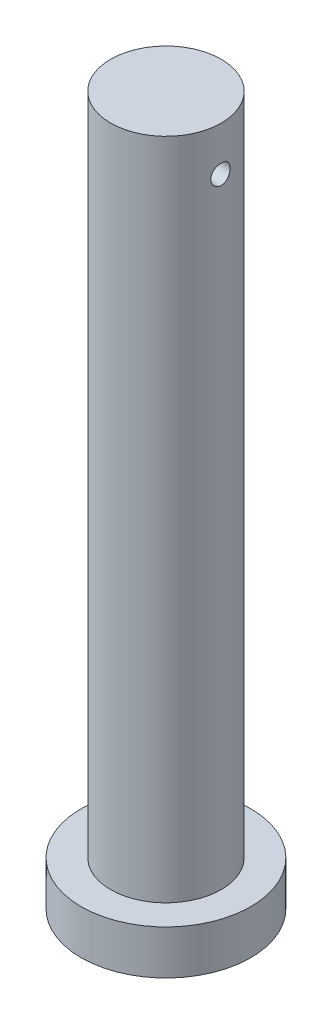
ISO-10303-21;
HEADER;
FILE_DESCRIPTION(('STEP AP214'),'2;1');
FILE_NAME('part.step','',(''),(''),'','','');
FILE_SCHEMA(('AUTOMOTIVE_DESIGN { 1 0 10303 214 1 1 1 1 }'));
ENDSEC;
DATA;
#1=APPLICATION_CONTEXT('core data for automotive mechanical design processes');
#2=APPLICATION_PROTOCOL_DEFINITION('international standard','automotive_design',2000,#1);
#3=PRODUCT_CONTEXT('',#1,'mechanical');
#4=PRODUCT('Part','Part','',(#3));
#5=PRODUCT_RELATED_PRODUCT_CATEGORY('part','',(#4));
#6=PRODUCT_DEFINITION_FORMATION('','',#4);
#7=PRODUCT_DEFINITION_CONTEXT('part definition',#1,'design');
#8=PRODUCT_DEFINITION('design','',#6,#7);
#9=PRODUCT_DEFINITION_SHAPE('','',#8);
#10=(LENGTH_UNIT() NAMED_UNIT(*) SI_UNIT(.MILLI.,.METRE.));
#11=(NAMED_UNIT(*) PLANE_ANGLE_UNIT() SI_UNIT($,.RADIAN.));
#12=(NAMED_UNIT(*) SI_UNIT($,.STERADIAN.) SOLID_ANGLE_UNIT());
#13=UNCERTAINTY_MEASURE_WITH_UNIT(LENGTH_MEASURE(1.E-05),#10,'distance_accuracy_value','');
#14=(GEOMETRIC_REPRESENTATION_CONTEXT(3) GLOBAL_UNCERTAINTY_ASSIGNED_CONTEXT((#13)) GLOBAL_UNIT_ASSIGNED_CONTEXT((#10,
#11,#12)) REPRESENTATION_CONTEXT('',''));
#15=CARTESIAN_POINT('',(0.,0.,0.));
#16=DIRECTION('',(0.,0.,1.));
#17=DIRECTION('',(1.,0.,0.));
#18=AXIS2_PLACEMENT_3D('',#15,#16,#17);
#19=CARTESIAN_POINT('',(0.00144443242377544,63.2889157351468,-3.00224429916459E-06));
#20=DIRECTION('',(0.,-1.,0.));
#21=DIRECTION('',(0.,0.,-1.));
#22=AXIS2_PLACEMENT_3D('',#19,#20,#21);
#23=CYLINDRICAL_SURFACE('',#22,7.59);
#24=CARTESIAN_POINT('',(0.00144443242377544,63.2889157351468,-3.00224429916459E-06));
#25=DIRECTION('',(0.,1.,0.));
#26=DIRECTION('',(0.,0.,1.));
#27=AXIS2_PLACEMENT_3D('',#24,#25,#26);
#28=CIRCLE('',#27,7.59);
#29=CARTESIAN_POINT('',(0.00144443242377544,63.2889157351468,7.5899969977557));
#30=VERTEX_POINT('',#29);
#31=EDGE_CURVE('E49',#30,#30,#28,.T.);
#32=ORIENTED_EDGE('',*,*,#31,.F.);
#33=EDGE_LOOP('',(#32));
#34=FACE_BOUND('',#33,.T.);
#35=CARTESIAN_POINT('',(0.00144443242377544,59.3289157351468,-3.00224429916459E-06));
#36=DIRECTION('',(0.,1.,0.));
#37=DIRECTION('',(0.,0.,1.));
#38=AXIS2_PLACEMENT_3D('',#35,#36,#37);
#39=CIRCLE('',#38,7.59);
#40=CARTESIAN_POINT('',(0.00144443242377544,59.3289157351468,7.5899969977557));
#41=VERTEX_POINT('',#40);
#42=EDGE_CURVE('E55',#41,#41,#39,.T.);
#43=ORIENTED_EDGE('',*,*,#42,.T.);
#44=EDGE_LOOP('',(#43));
#45=FACE_BOUND('',#44,.T.);
#46=ADVANCED_FACE('F36',(#34,#45),#23,.T.);
#47=CARTESIAN_POINT('',(0.00144443242377544,63.2889157351468,-3.00224429916459E-06));
#48=DIRECTION('',(0.,1.,0.));
#49=DIRECTION('',(0.,0.,1.));
#50=AXIS2_PLACEMENT_3D('',#47,#48,#49);
#51=PLANE('',#50);
#52=CARTESIAN_POINT('',(0.00144443242377544,63.2889157351468,-3.00224429916459E-06));
#53=DIRECTION('',(0.,1.,0.));
#54=DIRECTION('',(0.,0.,1.));
#55=AXIS2_PLACEMENT_3D('',#52,#53,#54);
#56=CIRCLE('',#55,4.95);
#57=CARTESIAN_POINT('',(0.00144443242377544,63.2889157351468,4.9499969977557));
#58=VERTEX_POINT('',#57);
#59=EDGE_CURVE('E10',#58,#58,#56,.T.);
#60=ORIENTED_EDGE('',*,*,#59,.F.);
#61=EDGE_LOOP('',(#60));
#62=FACE_BOUND('',#61,.T.);
#63=ORIENTED_EDGE('',*,*,#31,.T.);
#64=EDGE_LOOP('',(#63));
#65=FACE_BOUND('',#64,.T.);
#66=ADVANCED_FACE('F87',(#62,#65),#51,.T.);
#67=CARTESIAN_POINT('',(0.00144443242377544,59.3289157351468,-3.00224429916459E-06));
#68=DIRECTION('',(0.,1.,0.));
#69=DIRECTION('',(0.,0.,1.));
#70=AXIS2_PLACEMENT_3D('',#67,#68,#69);
#71=PLANE('',#70);
#72=ORIENTED_EDGE('',*,*,#42,.F.);
#73=EDGE_LOOP('',(#72));
#74=FACE_BOUND('',#73,.T.);
#75=ADVANCED_FACE('F83',(#74),#71,.F.);
#76=CARTESIAN_POINT('',(0.00144443242377544,122.688915735147,-3.00224429916459E-06));
#77=DIRECTION('',(0.,-1.,0.));
#78=DIRECTION('',(0.,0.,-1.));
#79=AXIS2_PLACEMENT_3D('',#76,#77,#78);
#80=CYLINDRICAL_SURFACE('',#79,4.95);
#81=CARTESIAN_POINT('',(-4.90007908052978,118.079459855754,-0.691065410398251));
#82=CARTESIAN_POINT('',(-4.89495599735033,118.118189925098,-0.727402755261876));
#83=CARTESIAN_POINT('',(-4.88987683232503,118.15999961325,-0.760501352822298));
#84=CARTESIAN_POINT('',(-4.88037601773705,118.248644342118,-0.819283445436213));
#85=CARTESIAN_POINT('',(-4.87595487823281,118.295483233234,-0.844961202707104));
#86=CARTESIAN_POINT('',(-4.86827746003247,118.392903744451,-0.888142679396293));
#87=CARTESIAN_POINT('',(-4.86502155809035,118.443486568702,-0.905643755622012));
#88=CARTESIAN_POINT('',(-4.86005982647335,118.546933908938,-0.931913562041067));
#89=CARTESIAN_POINT('',(-4.85835359246656,118.599797825979,-0.940684570099145));
#90=CARTESIAN_POINT('',(-4.85670336698135,118.705644231934,-0.949170357653602));
#91=CARTESIAN_POINT('',(-4.85673876697739,118.758617919909,-0.948991044748464));
#92=CARTESIAN_POINT('',(-4.85851632414475,118.863771407542,-0.939844772321565));
#93=CARTESIAN_POINT('',(-4.8602584844299,118.915951205751,-0.93087779676749));
#94=CARTESIAN_POINT('',(-4.86523119994961,119.01772690359,-0.904516677443337));
#95=CARTESIAN_POINT('',(-4.86845288906014,119.067336263067,-0.887172701536471));
#96=CARTESIAN_POINT('',(-4.87601727258415,119.162951410758,-0.844593104697442));
#97=CARTESIAN_POINT('',(-4.88036006031427,119.208956898582,-0.819356826798418));
#98=CARTESIAN_POINT('',(-4.88975026287195,119.296731677797,-0.761309466104932));
#99=CARTESIAN_POINT('',(-4.89480636362383,119.338435722807,-0.728401134229309));
#100=CARTESIAN_POINT('',(-4.90501701660969,119.415774373245,-0.656102122251911));
#101=CARTESIAN_POINT('',(-4.9101715766152,119.451408497347,-0.616710928564912));
#102=CARTESIAN_POINT('',(-4.92006965370436,119.51600552008,-0.532012923633531));
#103=CARTESIAN_POINT('',(-4.92480775845951,119.544886935462,-0.486643257803999));
#104=CARTESIAN_POINT('',(-4.93327168219786,119.594600831314,-0.39160193906133));
#105=CARTESIAN_POINT('',(-4.93699756380745,119.615433809777,-0.341930552547197));
#106=CARTESIAN_POINT('',(-4.94298749501117,119.648266326851,-0.240143524309112));
#107=CARTESIAN_POINT('',(-4.94526401832521,119.660341368709,-0.188052996782051));
#108=CARTESIAN_POINT('',(-4.9481485738841,119.67556672757,-0.0825402793940582));
#109=CARTESIAN_POINT('',(-4.94875678818397,119.678718018383,-0.0291182354775605));
#110=CARTESIAN_POINT('',(-4.9482402977819,119.676017378221,0.0766394281794855));
#111=CARTESIAN_POINT('',(-4.94714285842488,119.670307104005,0.12897886410566));
#112=CARTESIAN_POINT('',(-4.94338704993004,119.650326863459,0.231937530612856));
#113=CARTESIAN_POINT('',(-4.94072867173778,119.636056847476,0.282556751213748));
#114=CARTESIAN_POINT('',(-4.93413877047588,119.599377639861,0.380709694990385));
#115=CARTESIAN_POINT('',(-4.93020619821138,119.576961738902,0.428240836530293));
#116=CARTESIAN_POINT('',(-4.92149335727174,119.524640757121,0.518899962336921));
#117=CARTESIAN_POINT('',(-4.91671300191952,119.494734910399,0.56202749566894));
#118=CARTESIAN_POINT('',(-4.90673640667597,119.427712936716,0.643402792437063));
#119=CARTESIAN_POINT('',(-4.90153468163292,119.390487794818,0.681560127991395));
#120=CARTESIAN_POINT('',(-4.89136054695369,119.310161916337,0.751128530174347));
#121=CARTESIAN_POINT('',(-4.88638815044729,119.267060843896,0.782539210911107));
#122=CARTESIAN_POINT('',(-4.87719560863249,119.175794618887,0.837952418006076));
#123=CARTESIAN_POINT('',(-4.87298156661453,119.127592942686,0.861895885534244));
#124=CARTESIAN_POINT('',(-4.86584551099054,119.027756811035,0.90132540699342));
#125=CARTESIAN_POINT('',(-4.86292337435158,118.97612268301,0.916812266311424));
#126=CARTESIAN_POINT('',(-4.85874563059813,118.871562921165,0.938707051751908));
#127=CARTESIAN_POINT('',(-4.85746994586393,118.818661018978,0.945224422453119));
#128=CARTESIAN_POINT('',(-4.85667032727327,118.712501078637,0.949326180959766));
#129=CARTESIAN_POINT('',(-4.85714625090618,118.659243069808,0.946911295492366));
#130=CARTESIAN_POINT('',(-4.85977596134865,118.5545847389,0.933314779375771));
#131=CARTESIAN_POINT('',(-4.86190865363964,118.503169502747,0.922243355188658));
#132=CARTESIAN_POINT('',(-4.86758104226575,118.402937744208,0.891808951012929));
#133=CARTESIAN_POINT('',(-4.87112080929965,118.354121352543,0.872445554388615));
#134=CARTESIAN_POINT('',(-4.87923975000432,118.260062531262,0.825819815553157));
#135=CARTESIAN_POINT('',(-4.88382642012646,118.214849216405,0.798500091665455));
#136=CARTESIAN_POINT('',(-4.89351433303298,118.129604111476,0.736781700959269));
#137=CARTESIAN_POINT('',(-4.8986156291348,118.08957285927,0.702382300271248));
#138=CARTESIAN_POINT('',(-4.9088547342977,118.015180447045,0.626841569008801));
#139=CARTESIAN_POINT('',(-4.91399187940999,117.980917035736,0.585603802047339));
#140=CARTESIAN_POINT('',(-4.92364811071522,117.919790847489,0.497899240611265));
#141=CARTESIAN_POINT('',(-4.92816719898131,117.892928045726,0.451432463677349));
#142=CARTESIAN_POINT('',(-4.9360766682561,117.847412450377,0.354596056063887));
#143=CARTESIAN_POINT('',(-4.9394680630858,117.828752277561,0.304229981442878));
#144=CARTESIAN_POINT('',(-4.94474259401369,117.80019012017,0.200999646654863));
#145=CARTESIAN_POINT('',(-4.94662594275939,117.790286900767,0.148135739817424));
#146=CARTESIAN_POINT('',(-4.94865260491737,117.779644565855,0.0423382561333979));
#147=CARTESIAN_POINT('',(-4.94882393347962,117.778757901005,-0.0105799758400142));
#148=CARTESIAN_POINT('',(-4.94748042335546,117.785794092874,-0.115812577800432));
#149=CARTESIAN_POINT('',(-4.94596539593655,117.793717935642,-0.16812687953505));
#150=CARTESIAN_POINT('',(-4.94143343569516,117.818039361666,-0.270296006640914));
#151=CARTESIAN_POINT('',(-4.93842672868346,117.834379279497,-0.320165071689242));
#152=CARTESIAN_POINT('',(-4.93124400187464,117.875003888718,-0.416432432742597));
#153=CARTESIAN_POINT('',(-4.9270687789397,117.899283167804,-0.462833066794751));
#154=CARTESIAN_POINT('',(-4.91905933883654,117.948556841167,-0.54065095794003));
#155=CARTESIAN_POINT('',(-4.91537289192937,117.972062349154,-0.573037994175894));
#156=CARTESIAN_POINT('',(-4.90780904893326,118.022951259387,-0.634582403290295));
#157=CARTESIAN_POINT('',(-4.90393164673624,118.050334785733,-0.663739672761222));
#158=CARTESIAN_POINT('',(-4.90007908052978,118.079459855754,-0.691065410398251));
#159=B_SPLINE_CURVE_WITH_KNOTS('',3,(#81,#82,#83,#84,#85,#86,#87,#88,#89,#90,#91,#92,#93,#94,
#95,#96,#97,#98,#99,#100,#101,#102,#103,#104,#105,#106,#107,#108,#109,#110,#111,#112,#113,#114,
#115,#116,#117,#118,#119,#120,#121,#122,#123,#124,#125,#126,#127,#128,#129,#130,#131,#132,#133,
#134,#135,#136,#137,#138,#139,#140,#141,#142,#143,#144,#145,#146,#147,#148,#149,#150,#151,#152,
#153,#154,#155,#156,#157,#158),.UNSPECIFIED.,.T.,.F.,(4,2,2,2,2,2,2,2,2,2,2,2,2,2,2,2,2,2,2,2,2,
2,2,2,2,2,2,2,2,2,2,2,2,2,2,2,2,2,4),(0.,0.159919810378797,0.31996294170883,0.480057772820829,
0.640110820748888,0.798270442792579,0.956430353385052,1.1136546103276,1.27089195833433,
1.43024262698426,1.58960592579369,1.75080299909523,1.91199009683643,2.07177050588673,
2.23153347812964,2.38876874045826,2.54600491485907,2.70337089085917,2.86075296519478,
3.02068606367833,3.18062830750236,3.34180522139413,3.50296678250641,3.66214389393297,
3.82130805501596,3.97847824967643,4.13565634238519,4.2939973427624,4.45235476482382,
4.61317233441302,4.7739893645563,4.93466142330099,5.09531082190851,5.25332699511903,
5.41136085485845,5.56832602191853,5.72518440729349,5.84544049453635,5.9657004309124),.UNSPECIFIED.);
#160=CARTESIAN_POINT('',(-4.90007908052978,118.079459855754,-0.691065410398251));
#161=VERTEX_POINT('',#160);
#162=EDGE_CURVE('E39',#161,#161,#159,.T.);
#163=ORIENTED_EDGE('',*,*,#162,.T.);
#164=EDGE_LOOP('',(#163));
#165=FACE_BOUND('',#164,.T.);
#166=CARTESIAN_POINT('',(4.91067083887217,118.138168956503,-0.63403461835647));
#167=CARTESIAN_POINT('',(4.91495710541087,118.102601342336,-0.600844052219494));
#168=CARTESIAN_POINT('',(4.91929003064715,118.069818375723,-0.56463744786279));
#169=CARTESIAN_POINT('',(4.92756540903833,118.010750460956,-0.487187018259596));
#170=CARTESIAN_POINT('',(4.93150751368769,117.984471281718,-0.445938769125461));
#171=CARTESIAN_POINT('',(4.93855916059895,117.939182236374,-0.359549746870321));
#172=CARTESIAN_POINT('',(4.94166861169937,117.920173166126,-0.314408548251949));
#173=CARTESIAN_POINT('',(4.94670376652469,117.890005512968,-0.22152255179351));
#174=CARTESIAN_POINT('',(4.94862978096096,117.878844869341,-0.173778440935357));
#175=CARTESIAN_POINT('',(4.95106985256949,117.864777825604,-0.0774979613639254));
#176=CARTESIAN_POINT('',(4.95159659906627,117.861797236051,-0.0289727558949961));
#177=CARTESIAN_POINT('',(4.95121575203002,117.863970871397,0.0678893210379334));
#178=CARTESIAN_POINT('',(4.95030817653731,117.869124993981,0.116226194863029));
#179=CARTESIAN_POINT('',(4.94717253532651,117.887336365243,0.210956261598021));
#180=CARTESIAN_POINT('',(4.94495459824257,117.900333010274,0.257361471183867));
#181=CARTESIAN_POINT('',(4.93944937110962,117.933789500525,0.347330167766493));
#182=CARTESIAN_POINT('',(4.93616202564737,117.954249732489,0.390893507366385));
#183=CARTESIAN_POINT('',(4.92884323940337,118.002252281893,0.474352052798321));
#184=CARTESIAN_POINT('',(4.92480572103606,118.029853223757,0.514212994257115));
#185=CARTESIAN_POINT('',(4.91644740073882,118.09128550072,0.58877182136046));
#186=CARTESIAN_POINT('',(4.91212657606183,118.1251173365,0.623469291689821));
#187=CARTESIAN_POINT('',(4.90362733365883,118.198521337878,0.687127544309741));
#188=CARTESIAN_POINT('',(4.89945113755306,118.23815529945,0.716017428026313));
#189=CARTESIAN_POINT('',(4.89176992574337,118.321773754699,0.766728325135616));
#190=CARTESIAN_POINT('',(4.88826489219767,118.365758132679,0.788549526448677));
#191=CARTESIAN_POINT('',(4.88234443491948,118.456667864534,0.824403538417949));
#192=CARTESIAN_POINT('',(4.87992483229983,118.503581133006,0.838466267976142));
#193=CARTESIAN_POINT('',(4.87644062486845,118.599152835874,0.858493952570328));
#194=CARTESIAN_POINT('',(4.87537587893801,118.647811087972,0.864459750968174));
#195=CARTESIAN_POINT('',(4.8747326663141,118.744741117052,0.868078185566242));
#196=CARTESIAN_POINT('',(4.87513301074659,118.793008364452,0.865849334720945));
#197=CARTESIAN_POINT('',(4.87732591183052,118.888469681685,0.853413021218388));
#198=CARTESIAN_POINT('',(4.87911844864047,118.935663766804,0.843205672270515));
#199=CARTESIAN_POINT('',(4.88388209186337,119.027515910211,0.815167077051827));
#200=CARTESIAN_POINT('',(4.88684983214725,119.072180798815,0.797357594274002));
#201=CARTESIAN_POINT('',(4.89363007048692,119.157906037091,0.75463946170205));
#202=CARTESIAN_POINT('',(4.89744263782594,119.198966090749,0.729730229618249));
#203=CARTESIAN_POINT('',(4.90554542483431,119.276895920403,0.673137881886917));
#204=CARTESIAN_POINT('',(4.90984123534723,119.313703926405,0.641370499509886));
#205=CARTESIAN_POINT('',(4.91839200437986,119.381505579333,0.572134071007319));
#206=CARTESIAN_POINT('',(4.92264696035603,119.412498866443,0.534664672299984));
#207=CARTESIAN_POINT('',(4.93068337070698,119.468071022649,0.454674058054703));
#208=CARTESIAN_POINT('',(4.93446014508153,119.492588716103,0.412109824929217));
#209=CARTESIAN_POINT('',(4.94106879361024,119.534117620665,0.323396218914026));
#210=CARTESIAN_POINT('',(4.94390072277201,119.551129268784,0.277247054927042));
#211=CARTESIAN_POINT('',(4.9482810397018,119.577025353334,0.1830578651317));
#212=CARTESIAN_POINT('',(4.94983944821479,119.585973297854,0.135035779042568));
#213=CARTESIAN_POINT('',(4.95153441764175,119.595692651382,0.0381479535342224));
#214=CARTESIAN_POINT('',(4.95167109045031,119.596464703857,-0.0107177191891438));
#215=CARTESIAN_POINT('',(4.95051441082428,119.58984889653,-0.107298464628172));
#216=CARTESIAN_POINT('',(4.94923777148371,119.582556404913,-0.155020310144521));
#217=CARTESIAN_POINT('',(4.94542223473708,119.560187578257,-0.248549427792865));
#218=CARTESIAN_POINT('',(4.94288331336217,119.545111095411,-0.294356663551363));
#219=CARTESIAN_POINT('',(4.93681211941417,119.507566439719,-0.38291741757463));
#220=CARTESIAN_POINT('',(4.93327700127948,119.485077060799,-0.425661741632605));
#221=CARTESIAN_POINT('',(4.92560152583394,119.43335682107,-0.506796823788057));
#222=CARTESIAN_POINT('',(4.92146111497168,119.404125363644,-0.545187196148833));
#223=CARTESIAN_POINT('',(4.91296937703276,119.339297092933,-0.617053515473072));
#224=CARTESIAN_POINT('',(4.90861600524159,119.303622332519,-0.65045894172955));
#225=CARTESIAN_POINT('',(4.90023650137563,119.227146743741,-0.710824792553616));
#226=CARTESIAN_POINT('',(4.8962103772644,119.186345790694,-0.737785060309052));
#227=CARTESIAN_POINT('',(4.88893280724195,119.100615761238,-0.784554824756106));
#228=CARTESIAN_POINT('',(4.88568356327082,119.05567543972,-0.804344076230442));
#229=CARTESIAN_POINT('',(4.88035437571958,118.963038335261,-0.836064367139764));
#230=CARTESIAN_POINT('',(4.87827428829097,118.915341892218,-0.847996373330872));
#231=CARTESIAN_POINT('',(4.87554841074343,118.819208076311,-0.863526312934187));
#232=CARTESIAN_POINT('',(4.87488433531464,118.770788383289,-0.867230520343747));
#233=CARTESIAN_POINT('',(4.87501404632702,118.674004949586,-0.866501380162994));
#234=CARTESIAN_POINT('',(4.87580799964586,118.625641215943,-0.862067101087897));
#235=CARTESIAN_POINT('',(4.87874715855729,118.530799242633,-0.845277339017472));
#236=CARTESIAN_POINT('',(4.880880384905,118.484308135667,-0.832992062691066));
#237=CARTESIAN_POINT('',(4.88624315610844,118.394078296929,-0.800942093774801));
#238=CARTESIAN_POINT('',(4.88947184261435,118.350337441904,-0.781183255720747));
#239=CARTESIAN_POINT('',(4.89571662639171,118.277760730172,-0.740878687494287));
#240=CARTESIAN_POINT('',(4.89856601344925,118.248026537423,-0.721901311573655));
#241=CARTESIAN_POINT('',(4.90449240022355,118.191098532351,-0.680487242690345));
#242=CARTESIAN_POINT('',(4.90756940522893,118.163904779088,-0.658050469336765));
#243=CARTESIAN_POINT('',(4.91067083887217,118.138168956503,-0.63403461835647));
#244=B_SPLINE_CURVE_WITH_KNOTS('',3,(#166,#167,#168,#169,#170,#171,#172,#173,#174,#175,#176,
#177,#178,#179,#180,#181,#182,#183,#184,#185,#186,#187,#188,#189,#190,#191,#192,#193,#194,#195,
#196,#197,#198,#199,#200,#201,#202,#203,#204,#205,#206,#207,#208,#209,#210,#211,#212,#213,#214,
#215,#216,#217,#218,#219,#220,#221,#222,#223,#224,#225,#226,#227,#228,#229,#230,#231,#232,#233,
#234,#235,#236,#237,#238,#239,#240,#241,#242,#243),.UNSPECIFIED.,.T.,.F.,(4,2,2,2,2,2,2,2,2,2,2,
2,2,2,2,2,2,2,2,2,2,2,2,2,2,2,2,2,2,2,2,2,2,2,2,2,2,2,4),(0.,0.146383987221714,
0.292897356643748,0.439426760246597,0.585917676088291,0.731075523886072,0.876231545960383,
1.0202799778165,1.16433587498146,1.30961421409349,1.45490423211797,1.60187259646175,
1.74883705334315,1.89523073932669,2.04160917603553,2.18587903531548,2.33014683850194,
2.47400437093919,2.6178737053243,2.76362311087214,2.90938153243836,3.05647132353867,
3.20355254977624,3.34946500564989,3.49536597771677,3.63955985648453,3.7837564733842,
3.92836922650252,4.07299478154111,4.21950402001368,4.36601682272617,4.51294009584595,
4.65984528813439,4.80484167301111,4.94985465438264,5.09358868113263,5.23721034391834,
5.34312761880362,5.44904735540918),.UNSPECIFIED.);
#245=CARTESIAN_POINT('',(4.91067083887217,118.138168956503,-0.63403461835647));
#246=VERTEX_POINT('',#245);
#247=EDGE_CURVE('E62',#246,#246,#244,.T.);
#248=ORIENTED_EDGE('',*,*,#247,.T.);
#249=EDGE_LOOP('',(#248));
#250=FACE_BOUND('',#249,.T.);
#251=CARTESIAN_POINT('',(0.00144443242377544,122.688915735147,-3.00224429916459E-06));
#252=DIRECTION('',(0.,1.,0.));
#253=DIRECTION('',(0.,0.,1.));
#254=AXIS2_PLACEMENT_3D('',#251,#252,#253);
#255=CIRCLE('',#254,4.95);
#256=CARTESIAN_POINT('',(0.00144443242377544,122.688915735147,4.9499969977557));
#257=VERTEX_POINT('',#256);
#258=EDGE_CURVE('E58',#257,#257,#255,.T.);
#259=ORIENTED_EDGE('',*,*,#258,.F.);
#260=EDGE_LOOP('',(#259));
#261=FACE_BOUND('',#260,.T.);
#262=ORIENTED_EDGE('',*,*,#59,.T.);
#263=EDGE_LOOP('',(#262));
#264=FACE_BOUND('',#263,.T.);
#265=ADVANCED_FACE('F68',(#165,#250,#261,#264),#80,.T.);
#266=CARTESIAN_POINT('',(0.00144443242377544,122.688915735147,-3.00224429916459E-06));
#267=DIRECTION('',(0.,1.,0.));
#268=DIRECTION('',(0.,0.,1.));
#269=AXIS2_PLACEMENT_3D('',#266,#267,#268);
#270=PLANE('',#269);
#271=ORIENTED_EDGE('',*,*,#258,.T.);
#272=EDGE_LOOP('',(#271));
#273=FACE_BOUND('',#272,.T.);
#274=ADVANCED_FACE('F75',(#273),#270,.T.);
#275=CARTESIAN_POINT('',(9.90144443242378,118.728915735147,-3.00224430281401E-06));
#276=DIRECTION('',(-1.,0.,0.));
#277=DIRECTION('',(0.,0.,1.));
#278=AXIS2_PLACEMENT_3D('',#275,#276,#277);
#279=CONICAL_SURFACE('',#278,0.825,0.00833314044013593);
#280=ORIENTED_EDGE('',*,*,#247,.F.);
#281=EDGE_LOOP('',(#280));
#282=FACE_BOUND('',#281,.T.);
#283=ORIENTED_EDGE('',*,*,#162,.F.);
#284=EDGE_LOOP('',(#283));
#285=FACE_BOUND('',#284,.T.);
#286=ADVANCED_FACE('F72',(#282,#285),#279,.F.);
#287=CLOSED_SHELL('',(#46,#66,#75,#265,#274,#286));
#288=MANIFOLD_SOLID_BREP('B2',#287);
#289=ADVANCED_BREP_SHAPE_REPRESENTATION('',(#18,#288),#14);
#290=SHAPE_DEFINITION_REPRESENTATION(#9,#289);
ENDSEC;
END-ISO-10303-21;
